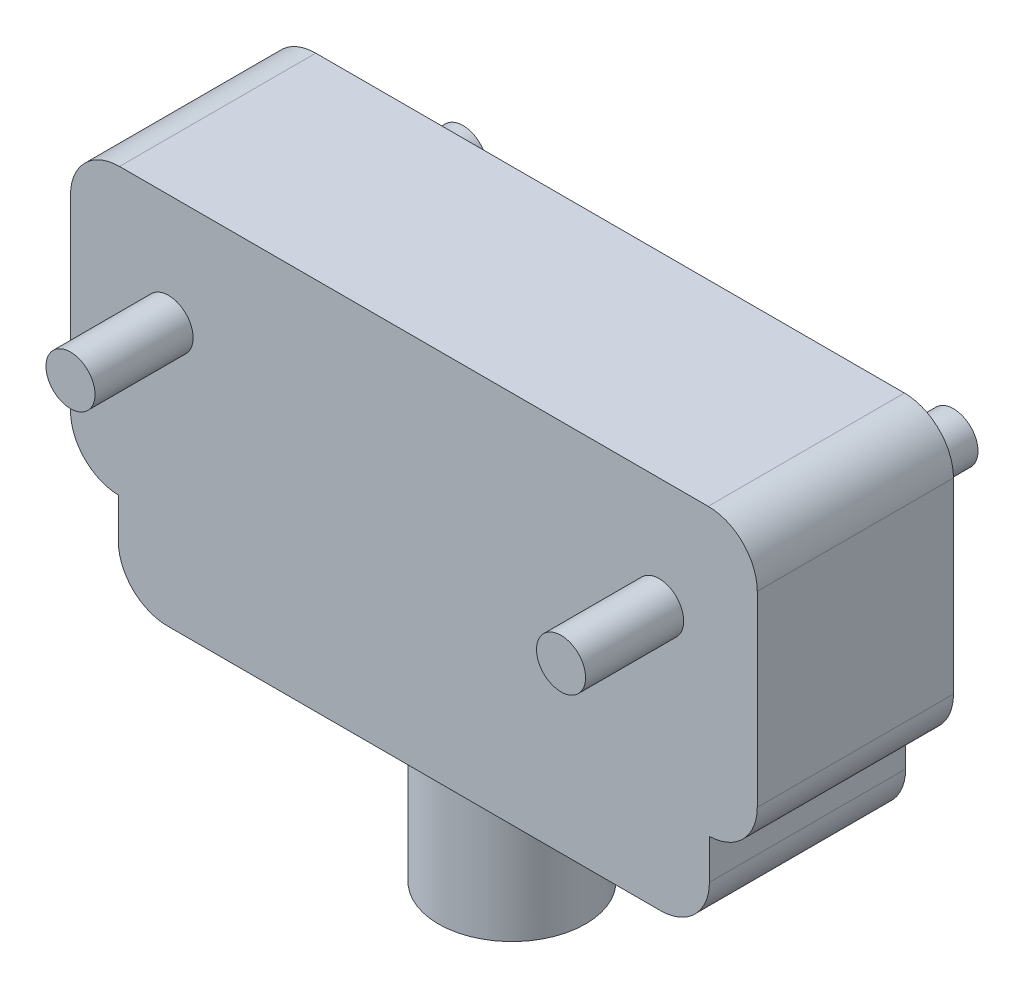
ISO-10303-21;
HEADER;
FILE_DESCRIPTION(('STEP AP214'),'2;1');
FILE_NAME('part.step','',(''),(''),'','','');
FILE_SCHEMA(('AUTOMOTIVE_DESIGN { 1 0 10303 214 1 1 1 1 }'));
ENDSEC;
DATA;
#1=APPLICATION_CONTEXT('core data for automotive mechanical design processes');
#2=APPLICATION_PROTOCOL_DEFINITION('international standard','automotive_design',2000,#1);
#3=PRODUCT_CONTEXT('',#1,'mechanical');
#4=PRODUCT('Part','Part','',(#3));
#5=PRODUCT_RELATED_PRODUCT_CATEGORY('part','',(#4));
#6=PRODUCT_DEFINITION_FORMATION('','',#4);
#7=PRODUCT_DEFINITION_CONTEXT('part definition',#1,'design');
#8=PRODUCT_DEFINITION('design','',#6,#7);
#9=PRODUCT_DEFINITION_SHAPE('','',#8);
#10=(LENGTH_UNIT() NAMED_UNIT(*) SI_UNIT(.MILLI.,.METRE.));
#11=(NAMED_UNIT(*) PLANE_ANGLE_UNIT() SI_UNIT($,.RADIAN.));
#12=(NAMED_UNIT(*) SI_UNIT($,.STERADIAN.) SOLID_ANGLE_UNIT());
#13=UNCERTAINTY_MEASURE_WITH_UNIT(LENGTH_MEASURE(1.E-05),#10,'distance_accuracy_value','');
#14=(GEOMETRIC_REPRESENTATION_CONTEXT(3) GLOBAL_UNCERTAINTY_ASSIGNED_CONTEXT((#13)) GLOBAL_UNIT_ASSIGNED_CONTEXT((#10,
#11,#12)) REPRESENTATION_CONTEXT('',''));
#15=CARTESIAN_POINT('',(0.,0.,0.));
#16=DIRECTION('',(0.,0.,1.));
#17=DIRECTION('',(1.,0.,0.));
#18=AXIS2_PLACEMENT_3D('',#15,#16,#17);
#19=CARTESIAN_POINT('',(90.0700000000001,-85.065581076565,-10.));
#20=DIRECTION('',(0.,0.,1.));
#21=DIRECTION('',(1.,0.,0.));
#22=AXIS2_PLACEMENT_3D('',#19,#20,#21);
#23=CYLINDRICAL_SURFACE('',#22,2.5);
#24=CARTESIAN_POINT('',(90.0700000000001,-85.065581076565,-10.));
#25=DIRECTION('',(0.,0.,1.));
#26=DIRECTION('',(1.,0.,0.));
#27=AXIS2_PLACEMENT_3D('',#24,#25,#26);
#28=CIRCLE('',#27,2.5);
#29=CARTESIAN_POINT('',(92.5700000000001,-85.065581076565,-10.));
#30=VERTEX_POINT('',#29);
#31=EDGE_CURVE('E160',#30,#30,#28,.T.);
#32=ORIENTED_EDGE('',*,*,#31,.T.);
#33=EDGE_LOOP('',(#32));
#34=FACE_BOUND('',#33,.T.);
#35=CARTESIAN_POINT('',(90.0700000000001,-85.065581076565,0.));
#36=DIRECTION('',(0.,0.,1.));
#37=DIRECTION('',(1.,0.,0.));
#38=AXIS2_PLACEMENT_3D('',#35,#36,#37);
#39=CIRCLE('',#38,2.5);
#40=CARTESIAN_POINT('',(92.5700000000001,-85.065581076565,0.));
#41=VERTEX_POINT('',#40);
#42=EDGE_CURVE('E156',#41,#41,#39,.T.);
#43=ORIENTED_EDGE('',*,*,#42,.F.);
#44=EDGE_LOOP('',(#43));
#45=FACE_BOUND('',#44,.T.);
#46=ADVANCED_FACE('F39',(#34,#45),#23,.T.);
#47=CARTESIAN_POINT('',(90.0700000000001,-85.065581076565,-10.));
#48=DIRECTION('',(0.,0.,1.));
#49=DIRECTION('',(1.,0.,0.));
#50=AXIS2_PLACEMENT_3D('',#47,#48,#49);
#51=PLANE('',#50);
#52=ORIENTED_EDGE('',*,*,#31,.F.);
#53=EDGE_LOOP('',(#52));
#54=FACE_BOUND('',#53,.T.);
#55=ADVANCED_FACE('F271',(#54),#51,.F.);
#56=CARTESIAN_POINT('',(30.0700000000001,-73.6824409539895,20.));
#57=DIRECTION('',(1.,0.,0.));
#58=DIRECTION('',(0.,1.,0.));
#59=AXIS2_PLACEMENT_3D('',#56,#57,#58);
#60=PLANE('',#59);
#61=DIRECTION('',(0.,-1.,0.));
#62=VECTOR('',#61,1.);
#63=CARTESIAN_POINT('',(30.0700000000001,-73.6824409539895,0.));
#64=LINE('',#63,#62);
#65=CARTESIAN_POINT('',(30.0700000000001,-78.6824409539895,0.));
#66=VERTEX_POINT('',#65);
#67=CARTESIAN_POINT('',(30.0700000000001,-97.7574937926458,0.));
#68=VERTEX_POINT('',#67);
#69=EDGE_CURVE('E212',#66,#68,#64,.T.);
#70=ORIENTED_EDGE('',*,*,#69,.T.);
#71=DIRECTION('',(0.,0.,-1.));
#72=VECTOR('',#71,1.);
#73=CARTESIAN_POINT('',(30.0700000000001,-97.7574937926458,20.));
#74=LINE('',#73,#72);
#75=CARTESIAN_POINT('',(30.0700000000001,-97.7574937926458,20.));
#76=VERTEX_POINT('',#75);
#77=EDGE_CURVE('E47',#68,#76,#74,.F.);
#78=ORIENTED_EDGE('',*,*,#77,.T.);
#79=DIRECTION('',(0.,-1.,0.));
#80=VECTOR('',#79,1.);
#81=CARTESIAN_POINT('',(30.0700000000001,-73.6824409539895,20.));
#82=LINE('',#81,#80);
#83=CARTESIAN_POINT('',(30.0700000000001,-78.6824409539895,20.));
#84=VERTEX_POINT('',#83);
#85=EDGE_CURVE('E137',#84,#76,#82,.T.);
#86=ORIENTED_EDGE('',*,*,#85,.F.);
#87=DIRECTION('',(0.,0.,-1.));
#88=VECTOR('',#87,1.);
#89=CARTESIAN_POINT('',(30.0700000000001,-78.6824409539895,20.));
#90=LINE('',#89,#88);
#91=EDGE_CURVE('E205',#84,#66,#90,.T.);
#92=ORIENTED_EDGE('',*,*,#91,.T.);
#93=EDGE_LOOP('',(#70,#78,#86,#92));
#94=FACE_BOUND('',#93,.T.);
#95=ADVANCED_FACE('F209',(#94),#60,.F.);
#96=CARTESIAN_POINT('',(34.9456611623685,-102.755947538901,20.));
#97=DIRECTION('',(1.,0.,0.));
#98=DIRECTION('',(0.,0.,-1.));
#99=AXIS2_PLACEMENT_3D('',#96,#97,#98);
#100=PLANE('',#99);
#101=DIRECTION('',(0.,-1.,0.));
#102=VECTOR('',#101,1.);
#103=CARTESIAN_POINT('',(34.9456611623685,-102.755947538901,0.));
#104=LINE('',#103,#102);
#105=CARTESIAN_POINT('',(34.9456611623685,-102.755947538901,0.));
#106=VERTEX_POINT('',#105);
#107=CARTESIAN_POINT('',(34.9456611623685,-106.806017714321,0.));
#108=VERTEX_POINT('',#107);
#109=EDGE_CURVE('E214',#106,#108,#104,.T.);
#110=ORIENTED_EDGE('',*,*,#109,.T.);
#111=DIRECTION('',(0.,0.,-1.));
#112=VECTOR('',#111,1.);
#113=CARTESIAN_POINT('',(34.9456611623685,-106.806017714321,20.));
#114=LINE('',#113,#112);
#115=CARTESIAN_POINT('',(34.9456611623685,-106.806017714321,20.));
#116=VERTEX_POINT('',#115);
#117=EDGE_CURVE('E151',#108,#116,#114,.F.);
#118=ORIENTED_EDGE('',*,*,#117,.T.);
#119=DIRECTION('',(0.,-1.,0.));
#120=VECTOR('',#119,1.);
#121=CARTESIAN_POINT('',(34.9456611623685,-102.755947538901,20.));
#122=LINE('',#121,#120);
#123=CARTESIAN_POINT('',(34.9456611623685,-102.755947538901,20.));
#124=VERTEX_POINT('',#123);
#125=EDGE_CURVE('E134',#124,#116,#122,.T.);
#126=ORIENTED_EDGE('',*,*,#125,.F.);
#127=DIRECTION('',(0.,0.,-1.));
#128=VECTOR('',#127,1.);
#129=CARTESIAN_POINT('',(34.9456611623685,-102.755947538901,20.));
#130=LINE('',#129,#128);
#131=EDGE_CURVE('E148',#124,#106,#130,.T.);
#132=ORIENTED_EDGE('',*,*,#131,.T.);
#133=EDGE_LOOP('',(#110,#118,#126,#132));
#134=FACE_BOUND('',#133,.T.);
#135=ADVANCED_FACE('F147',(#134),#100,.F.);
#136=CARTESIAN_POINT('',(34.9456611623685,-111.806017714321,20.));
#137=DIRECTION('',(0.,1.,0.));
#138=DIRECTION('',(0.,0.,1.));
#139=AXIS2_PLACEMENT_3D('',#136,#137,#138);
#140=PLANE('',#139);
#141=CARTESIAN_POINT('',(65.0700000000001,-111.806017714321,10.));
#142=DIRECTION('',(0.,1.,0.));
#143=DIRECTION('',(0.,0.,1.));
#144=AXIS2_PLACEMENT_3D('',#141,#142,#143);
#145=CIRCLE('',#144,7.50000000000001);
#146=CARTESIAN_POINT('',(65.0700000000001,-111.806017714321,17.5));
#147=VERTEX_POINT('',#146);
#148=EDGE_CURVE('E11',#147,#147,#145,.F.);
#149=ORIENTED_EDGE('',*,*,#148,.F.);
#150=EDGE_LOOP('',(#149));
#151=FACE_BOUND('',#150,.T.);
#152=DIRECTION('',(1.,0.,0.));
#153=VECTOR('',#152,1.);
#154=CARTESIAN_POINT('',(34.9456611623685,-111.806017714321,0.));
#155=LINE('',#154,#153);
#156=CARTESIAN_POINT('',(39.9456611623685,-111.806017714321,0.));
#157=VERTEX_POINT('',#156);
#158=CARTESIAN_POINT('',(90.1943388376317,-111.806017714321,0.));
#159=VERTEX_POINT('',#158);
#160=EDGE_CURVE('E217',#157,#159,#155,.T.);
#161=ORIENTED_EDGE('',*,*,#160,.T.);
#162=DIRECTION('',(0.,0.,-1.));
#163=VECTOR('',#162,1.);
#164=CARTESIAN_POINT('',(90.1943388376317,-111.806017714321,20.));
#165=LINE('',#164,#163);
#166=CARTESIAN_POINT('',(90.1943388376317,-111.806017714321,20.));
#167=VERTEX_POINT('',#166);
#168=EDGE_CURVE('E62',#159,#167,#165,.F.);
#169=ORIENTED_EDGE('',*,*,#168,.T.);
#170=DIRECTION('',(1.,0.,0.));
#171=VECTOR('',#170,1.);
#172=CARTESIAN_POINT('',(34.9456611623685,-111.806017714321,20.));
#173=LINE('',#172,#171);
#174=CARTESIAN_POINT('',(39.9456611623685,-111.806017714321,20.));
#175=VERTEX_POINT('',#174);
#176=EDGE_CURVE('E152',#175,#167,#173,.T.);
#177=ORIENTED_EDGE('',*,*,#176,.F.);
#178=DIRECTION('',(0.,0.,-1.));
#179=VECTOR('',#178,1.);
#180=CARTESIAN_POINT('',(39.9456611623685,-111.806017714321,20.));
#181=LINE('',#180,#179);
#182=EDGE_CURVE('E200',#175,#157,#181,.T.);
#183=ORIENTED_EDGE('',*,*,#182,.T.);
#184=EDGE_LOOP('',(#161,#169,#177,#183));
#185=FACE_BOUND('',#184,.T.);
#186=ADVANCED_FACE('F403',(#151,#185),#140,.F.);
#187=CARTESIAN_POINT('',(95.1943388376317,-102.755947538901,20.));
#188=DIRECTION('',(-1.,0.,0.));
#189=DIRECTION('',(0.,0.,1.));
#190=AXIS2_PLACEMENT_3D('',#187,#188,#189);
#191=PLANE('',#190);
#192=DIRECTION('',(0.,1.,0.));
#193=VECTOR('',#192,1.);
#194=CARTESIAN_POINT('',(95.1943388376317,-102.755947538901,20.));
#195=LINE('',#194,#193);
#196=CARTESIAN_POINT('',(95.1943388376317,-106.806017714321,20.));
#197=VERTEX_POINT('',#196);
#198=CARTESIAN_POINT('',(95.1943388376317,-102.755947538901,20.));
#199=VERTEX_POINT('',#198);
#200=EDGE_CURVE('E240',#197,#199,#195,.T.);
#201=ORIENTED_EDGE('',*,*,#200,.F.);
#202=DIRECTION('',(0.,0.,-1.));
#203=VECTOR('',#202,1.);
#204=CARTESIAN_POINT('',(95.1943388376317,-106.806017714321,20.));
#205=LINE('',#204,#203);
#206=CARTESIAN_POINT('',(95.1943388376317,-106.806017714321,0.));
#207=VERTEX_POINT('',#206);
#208=EDGE_CURVE('E197',#197,#207,#205,.T.);
#209=ORIENTED_EDGE('',*,*,#208,.T.);
#210=DIRECTION('',(0.,1.,0.));
#211=VECTOR('',#210,1.);
#212=CARTESIAN_POINT('',(95.1943388376317,-102.755947538901,0.));
#213=LINE('',#212,#211);
#214=CARTESIAN_POINT('',(95.1943388376317,-102.755947538901,0.));
#215=VERTEX_POINT('',#214);
#216=EDGE_CURVE('E226',#207,#215,#213,.T.);
#217=ORIENTED_EDGE('',*,*,#216,.T.);
#218=DIRECTION('',(0.,0.,-1.));
#219=VECTOR('',#218,1.);
#220=CARTESIAN_POINT('',(95.1943388376317,-102.755947538901,20.));
#221=LINE('',#220,#219);
#222=EDGE_CURVE('E157',#199,#215,#221,.T.);
#223=ORIENTED_EDGE('',*,*,#222,.F.);
#224=EDGE_LOOP('',(#201,#209,#217,#223));
#225=FACE_BOUND('',#224,.T.);
#226=ADVANCED_FACE('F267',(#225),#191,.F.);
#227=CARTESIAN_POINT('',(100.07,-73.6824409539895,20.));
#228=DIRECTION('',(-1.,0.,0.));
#229=DIRECTION('',(0.,-1.,0.));
#230=AXIS2_PLACEMENT_3D('',#227,#228,#229);
#231=PLANE('',#230);
#232=DIRECTION('',(0.,1.,0.));
#233=VECTOR('',#232,1.);
#234=CARTESIAN_POINT('',(100.07,-73.6824409539895,0.));
#235=LINE('',#234,#233);
#236=CARTESIAN_POINT('',(100.07,-97.7574937926458,0.));
#237=VERTEX_POINT('',#236);
#238=CARTESIAN_POINT('',(100.07,-78.6824409539895,0.));
#239=VERTEX_POINT('',#238);
#240=EDGE_CURVE('E229',#237,#239,#235,.T.);
#241=ORIENTED_EDGE('',*,*,#240,.T.);
#242=DIRECTION('',(0.,0.,-1.));
#243=VECTOR('',#242,1.);
#244=CARTESIAN_POINT('',(100.07,-78.6824409539895,20.));
#245=LINE('',#244,#243);
#246=CARTESIAN_POINT('',(100.07,-78.6824409539895,20.));
#247=VERTEX_POINT('',#246);
#248=EDGE_CURVE('E188',#239,#247,#245,.F.);
#249=ORIENTED_EDGE('',*,*,#248,.T.);
#250=DIRECTION('',(0.,1.,0.));
#251=VECTOR('',#250,1.);
#252=CARTESIAN_POINT('',(100.07,-73.6824409539895,20.));
#253=LINE('',#252,#251);
#254=CARTESIAN_POINT('',(100.07,-97.7574937926458,20.));
#255=VERTEX_POINT('',#254);
#256=EDGE_CURVE('E241',#255,#247,#253,.T.);
#257=ORIENTED_EDGE('',*,*,#256,.F.);
#258=DIRECTION('',(0.,0.,1.));
#259=VECTOR('',#258,1.);
#260=CARTESIAN_POINT('',(100.07,-97.7574937926458,20.));
#261=LINE('',#260,#259);
#262=EDGE_CURVE('E185',#255,#237,#261,.F.);
#263=ORIENTED_EDGE('',*,*,#262,.T.);
#264=EDGE_LOOP('',(#241,#249,#257,#263));
#265=FACE_BOUND('',#264,.T.);
#266=ADVANCED_FACE('F254',(#265),#231,.F.);
#267=CARTESIAN_POINT('',(30.0700000000001,-73.6824409539895,20.));
#268=DIRECTION('',(0.,-1.,0.));
#269=DIRECTION('',(0.,0.,-1.));
#270=AXIS2_PLACEMENT_3D('',#267,#268,#269);
#271=PLANE('',#270);
#272=DIRECTION('',(-1.,0.,0.));
#273=VECTOR('',#272,1.);
#274=CARTESIAN_POINT('',(30.0700000000001,-73.6824409539895,20.));
#275=LINE('',#274,#273);
#276=CARTESIAN_POINT('',(95.0700000000001,-73.6824409539895,20.));
#277=VERTEX_POINT('',#276);
#278=CARTESIAN_POINT('',(35.0700000000001,-73.6824409539895,20.));
#279=VERTEX_POINT('',#278);
#280=EDGE_CURVE('E163',#277,#279,#275,.T.);
#281=ORIENTED_EDGE('',*,*,#280,.F.);
#282=DIRECTION('',(0.,0.,-1.));
#283=VECTOR('',#282,1.);
#284=CARTESIAN_POINT('',(95.0700000000001,-73.6824409539895,20.));
#285=LINE('',#284,#283);
#286=CARTESIAN_POINT('',(95.0700000000001,-73.6824409539895,0.));
#287=VERTEX_POINT('',#286);
#288=EDGE_CURVE('E171',#277,#287,#285,.T.);
#289=ORIENTED_EDGE('',*,*,#288,.T.);
#290=DIRECTION('',(-1.,0.,0.));
#291=VECTOR('',#290,1.);
#292=CARTESIAN_POINT('',(30.0700000000001,-73.6824409539895,0.));
#293=LINE('',#292,#291);
#294=CARTESIAN_POINT('',(35.0700000000001,-73.6824409539895,0.));
#295=VERTEX_POINT('',#294);
#296=EDGE_CURVE('E231',#287,#295,#293,.T.);
#297=ORIENTED_EDGE('',*,*,#296,.T.);
#298=DIRECTION('',(0.,0.,-1.));
#299=VECTOR('',#298,1.);
#300=CARTESIAN_POINT('',(35.0700000000001,-73.6824409539895,20.));
#301=LINE('',#300,#299);
#302=EDGE_CURVE('E168',#295,#279,#301,.F.);
#303=ORIENTED_EDGE('',*,*,#302,.T.);
#304=EDGE_LOOP('',(#281,#289,#297,#303));
#305=FACE_BOUND('',#304,.T.);
#306=ADVANCED_FACE('F257',(#305),#271,.F.);
#307=CARTESIAN_POINT('',(0.,0.,20.));
#308=DIRECTION('',(0.,0.,1.));
#309=DIRECTION('',(1.,0.,0.));
#310=AXIS2_PLACEMENT_3D('',#307,#308,#309);
#311=PLANE('',#310);
#312=CARTESIAN_POINT('',(40.0700000000001,-85.065581076565,20.));
#313=DIRECTION('',(0.,0.,1.));
#314=DIRECTION('',(1.,0.,0.));
#315=AXIS2_PLACEMENT_3D('',#312,#313,#314);
#316=CIRCLE('',#315,2.5);
#317=CARTESIAN_POINT('',(42.5700000000001,-85.065581076565,20.));
#318=VERTEX_POINT('',#317);
#319=EDGE_CURVE('E343',#318,#318,#316,.T.);
#320=ORIENTED_EDGE('',*,*,#319,.F.);
#321=EDGE_LOOP('',(#320));
#322=FACE_BOUND('',#321,.T.);
#323=CARTESIAN_POINT('',(90.0700000000001,-85.065581076565,20.));
#324=DIRECTION('',(0.,0.,1.));
#325=DIRECTION('',(1.,0.,0.));
#326=AXIS2_PLACEMENT_3D('',#323,#324,#325);
#327=CIRCLE('',#326,2.5);
#328=CARTESIAN_POINT('',(92.5700000000001,-85.065581076565,20.));
#329=VERTEX_POINT('',#328);
#330=EDGE_CURVE('E337',#329,#329,#327,.T.);
#331=ORIENTED_EDGE('',*,*,#330,.F.);
#332=EDGE_LOOP('',(#331));
#333=FACE_BOUND('',#332,.T.);
#334=ORIENTED_EDGE('',*,*,#256,.T.);
#335=CARTESIAN_POINT('',(95.0700000000001,-78.6824409539895,20.));
#336=DIRECTION('',(0.,0.,1.));
#337=DIRECTION('',(1.,0.,0.));
#338=AXIS2_PLACEMENT_3D('',#335,#336,#337);
#339=CIRCLE('',#338,5.);
#340=EDGE_CURVE('E195',#247,#277,#339,.T.);
#341=ORIENTED_EDGE('',*,*,#340,.T.);
#342=ORIENTED_EDGE('',*,*,#280,.T.);
#343=CARTESIAN_POINT('',(35.0700000000001,-78.6824409539895,20.));
#344=DIRECTION('',(0.,0.,1.));
#345=DIRECTION('',(1.,0.,0.));
#346=AXIS2_PLACEMENT_3D('',#343,#344,#345);
#347=CIRCLE('',#346,5.);
#348=EDGE_CURVE('E142',#279,#84,#347,.T.);
#349=ORIENTED_EDGE('',*,*,#348,.T.);
#350=ORIENTED_EDGE('',*,*,#85,.T.);
#351=CARTESIAN_POINT('',(35.0700000000001,-97.7574937926458,20.));
#352=DIRECTION('',(0.,0.,1.));
#353=DIRECTION('',(1.,0.,0.));
#354=AXIS2_PLACEMENT_3D('',#351,#352,#353);
#355=CIRCLE('',#354,5.);
#356=EDGE_CURVE('E130',#76,#124,#355,.T.);
#357=ORIENTED_EDGE('',*,*,#356,.T.);
#358=ORIENTED_EDGE('',*,*,#125,.T.);
#359=CARTESIAN_POINT('',(39.9456611623685,-106.806017714321,20.));
#360=DIRECTION('',(0.,0.,1.));
#361=DIRECTION('',(1.,0.,0.));
#362=AXIS2_PLACEMENT_3D('',#359,#360,#361);
#363=CIRCLE('',#362,5.);
#364=EDGE_CURVE('E141',#116,#175,#363,.T.);
#365=ORIENTED_EDGE('',*,*,#364,.T.);
#366=ORIENTED_EDGE('',*,*,#176,.T.);
#367=CARTESIAN_POINT('',(90.1943388376317,-106.806017714321,20.));
#368=DIRECTION('',(0.,0.,1.));
#369=DIRECTION('',(1.,0.,0.));
#370=AXIS2_PLACEMENT_3D('',#367,#368,#369);
#371=CIRCLE('',#370,5.);
#372=EDGE_CURVE('E54',#167,#197,#371,.T.);
#373=ORIENTED_EDGE('',*,*,#372,.T.);
#374=ORIENTED_EDGE('',*,*,#200,.T.);
#375=CARTESIAN_POINT('',(95.0700000000001,-97.7574937926458,20.));
#376=DIRECTION('',(0.,0.,1.));
#377=DIRECTION('',(1.,0.,0.));
#378=AXIS2_PLACEMENT_3D('',#375,#376,#377);
#379=CIRCLE('',#378,5.);
#380=EDGE_CURVE('E193',#199,#255,#379,.T.);
#381=ORIENTED_EDGE('',*,*,#380,.T.);
#382=EDGE_LOOP('',(#334,#341,#342,#349,#350,#357,#358,#365,#366,#373,#374,#381));
#383=FACE_BOUND('',#382,.T.);
#384=ADVANCED_FACE('F133',(#322,#333,#383),#311,.T.);
#385=CARTESIAN_POINT('',(0.,0.,0.));
#386=DIRECTION('',(0.,0.,1.));
#387=DIRECTION('',(1.,0.,0.));
#388=AXIS2_PLACEMENT_3D('',#385,#386,#387);
#389=PLANE('',#388);
#390=CARTESIAN_POINT('',(40.0700000000001,-85.065581076565,0.));
#391=DIRECTION('',(0.,0.,1.));
#392=DIRECTION('',(1.,0.,0.));
#393=AXIS2_PLACEMENT_3D('',#390,#391,#392);
#394=CIRCLE('',#393,2.5);
#395=CARTESIAN_POINT('',(42.5700000000001,-85.065581076565,0.));
#396=VERTEX_POINT('',#395);
#397=EDGE_CURVE('E220',#396,#396,#394,.T.);
#398=ORIENTED_EDGE('',*,*,#397,.T.);
#399=EDGE_LOOP('',(#398));
#400=FACE_BOUND('',#399,.T.);
#401=ORIENTED_EDGE('',*,*,#42,.T.);
#402=EDGE_LOOP('',(#401));
#403=FACE_BOUND('',#402,.T.);
#404=ORIENTED_EDGE('',*,*,#296,.F.);
#405=CARTESIAN_POINT('',(95.0700000000001,-78.6824409539895,0.));
#406=DIRECTION('',(0.,0.,1.));
#407=DIRECTION('',(1.,0.,0.));
#408=AXIS2_PLACEMENT_3D('',#405,#406,#407);
#409=CIRCLE('',#408,5.);
#410=EDGE_CURVE('E183',#287,#239,#409,.F.);
#411=ORIENTED_EDGE('',*,*,#410,.T.);
#412=ORIENTED_EDGE('',*,*,#240,.F.);
#413=CARTESIAN_POINT('',(95.0700000000001,-97.7574937926458,0.));
#414=DIRECTION('',(0.,0.,1.));
#415=DIRECTION('',(1.,0.,0.));
#416=AXIS2_PLACEMENT_3D('',#413,#414,#415);
#417=CIRCLE('',#416,5.);
#418=EDGE_CURVE('E181',#237,#215,#417,.F.);
#419=ORIENTED_EDGE('',*,*,#418,.T.);
#420=ORIENTED_EDGE('',*,*,#216,.F.);
#421=CARTESIAN_POINT('',(90.1943388376317,-106.806017714321,0.));
#422=DIRECTION('',(0.,0.,1.));
#423=DIRECTION('',(1.,0.,0.));
#424=AXIS2_PLACEMENT_3D('',#421,#422,#423);
#425=CIRCLE('',#424,5.);
#426=EDGE_CURVE('E179',#207,#159,#425,.F.);
#427=ORIENTED_EDGE('',*,*,#426,.T.);
#428=ORIENTED_EDGE('',*,*,#160,.F.);
#429=CARTESIAN_POINT('',(39.9456611623685,-106.806017714321,0.));
#430=DIRECTION('',(0.,0.,1.));
#431=DIRECTION('',(1.,0.,0.));
#432=AXIS2_PLACEMENT_3D('',#429,#430,#431);
#433=CIRCLE('',#432,5.);
#434=EDGE_CURVE('E177',#157,#108,#433,.F.);
#435=ORIENTED_EDGE('',*,*,#434,.T.);
#436=ORIENTED_EDGE('',*,*,#109,.F.);
#437=CARTESIAN_POINT('',(35.0700000000001,-97.7574937926458,0.));
#438=DIRECTION('',(0.,0.,1.));
#439=DIRECTION('',(1.,0.,0.));
#440=AXIS2_PLACEMENT_3D('',#437,#438,#439);
#441=CIRCLE('',#440,5.);
#442=EDGE_CURVE('E155',#106,#68,#441,.F.);
#443=ORIENTED_EDGE('',*,*,#442,.T.);
#444=ORIENTED_EDGE('',*,*,#69,.F.);
#445=CARTESIAN_POINT('',(35.0700000000001,-78.6824409539895,0.));
#446=DIRECTION('',(0.,0.,1.));
#447=DIRECTION('',(1.,0.,0.));
#448=AXIS2_PLACEMENT_3D('',#445,#446,#447);
#449=CIRCLE('',#448,5.);
#450=EDGE_CURVE('E174',#66,#295,#449,.F.);
#451=ORIENTED_EDGE('',*,*,#450,.T.);
#452=EDGE_LOOP('',(#404,#411,#412,#419,#420,#427,#428,#435,#436,#443,#444,#451));
#453=FACE_BOUND('',#452,.T.);
#454=ADVANCED_FACE('F249',(#400,#403,#453),#389,.F.);
#455=CARTESIAN_POINT('',(40.0700000000001,-85.065581076565,-10.));
#456=DIRECTION('',(0.,0.,1.));
#457=DIRECTION('',(1.,0.,0.));
#458=AXIS2_PLACEMENT_3D('',#455,#456,#457);
#459=CYLINDRICAL_SURFACE('',#458,2.5);
#460=CARTESIAN_POINT('',(40.0700000000001,-85.065581076565,-10.));
#461=DIRECTION('',(0.,0.,1.));
#462=DIRECTION('',(1.,0.,0.));
#463=AXIS2_PLACEMENT_3D('',#460,#461,#462);
#464=CIRCLE('',#463,2.5);
#465=CARTESIAN_POINT('',(42.5700000000001,-85.065581076565,-10.));
#466=VERTEX_POINT('',#465);
#467=EDGE_CURVE('E215',#466,#466,#464,.T.);
#468=ORIENTED_EDGE('',*,*,#467,.T.);
#469=EDGE_LOOP('',(#468));
#470=FACE_BOUND('',#469,.T.);
#471=ORIENTED_EDGE('',*,*,#397,.F.);
#472=EDGE_LOOP('',(#471));
#473=FACE_BOUND('',#472,.T.);
#474=ADVANCED_FACE('F319',(#470,#473),#459,.T.);
#475=CARTESIAN_POINT('',(40.0700000000001,-85.065581076565,-10.));
#476=DIRECTION('',(0.,0.,1.));
#477=DIRECTION('',(1.,0.,0.));
#478=AXIS2_PLACEMENT_3D('',#475,#476,#477);
#479=PLANE('',#478);
#480=ORIENTED_EDGE('',*,*,#467,.F.);
#481=EDGE_LOOP('',(#480));
#482=FACE_BOUND('',#481,.T.);
#483=ADVANCED_FACE('F285',(#482),#479,.F.);
#484=CARTESIAN_POINT('',(95.0700000000001,-78.6824409539895,20.));
#485=DIRECTION('',(0.,0.,-1.));
#486=DIRECTION('',(-1.,0.,0.));
#487=AXIS2_PLACEMENT_3D('',#484,#485,#486);
#488=CYLINDRICAL_SURFACE('',#487,5.);
#489=ORIENTED_EDGE('',*,*,#340,.F.);
#490=ORIENTED_EDGE('',*,*,#248,.F.);
#491=ORIENTED_EDGE('',*,*,#410,.F.);
#492=ORIENTED_EDGE('',*,*,#288,.F.);
#493=EDGE_LOOP('',(#489,#490,#491,#492));
#494=FACE_BOUND('',#493,.T.);
#495=ADVANCED_FACE('F256',(#494),#488,.T.);
#496=CARTESIAN_POINT('',(95.0700000000001,-97.7574937926458,20.));
#497=DIRECTION('',(0.,0.,1.));
#498=DIRECTION('',(1.,0.,0.));
#499=AXIS2_PLACEMENT_3D('',#496,#497,#498);
#500=CYLINDRICAL_SURFACE('',#499,5.);
#501=ORIENTED_EDGE('',*,*,#380,.F.);
#502=ORIENTED_EDGE('',*,*,#222,.T.);
#503=ORIENTED_EDGE('',*,*,#418,.F.);
#504=ORIENTED_EDGE('',*,*,#262,.F.);
#505=EDGE_LOOP('',(#501,#502,#503,#504));
#506=FACE_BOUND('',#505,.T.);
#507=ADVANCED_FACE('F284',(#506),#500,.T.);
#508=CARTESIAN_POINT('',(90.1943388376317,-106.806017714321,20.));
#509=DIRECTION('',(0.,0.,-1.));
#510=DIRECTION('',(-1.,0.,0.));
#511=AXIS2_PLACEMENT_3D('',#508,#509,#510);
#512=CYLINDRICAL_SURFACE('',#511,5.);
#513=ORIENTED_EDGE('',*,*,#372,.F.);
#514=ORIENTED_EDGE('',*,*,#168,.F.);
#515=ORIENTED_EDGE('',*,*,#426,.F.);
#516=ORIENTED_EDGE('',*,*,#208,.F.);
#517=EDGE_LOOP('',(#513,#514,#515,#516));
#518=FACE_BOUND('',#517,.T.);
#519=ADVANCED_FACE('F288',(#518),#512,.T.);
#520=CARTESIAN_POINT('',(39.9456611623685,-106.806017714321,20.));
#521=DIRECTION('',(0.,0.,-1.));
#522=DIRECTION('',(-1.,0.,0.));
#523=AXIS2_PLACEMENT_3D('',#520,#521,#522);
#524=CYLINDRICAL_SURFACE('',#523,5.);
#525=ORIENTED_EDGE('',*,*,#364,.F.);
#526=ORIENTED_EDGE('',*,*,#117,.F.);
#527=ORIENTED_EDGE('',*,*,#434,.F.);
#528=ORIENTED_EDGE('',*,*,#182,.F.);
#529=EDGE_LOOP('',(#525,#526,#527,#528));
#530=FACE_BOUND('',#529,.T.);
#531=ADVANCED_FACE('F292',(#530),#524,.T.);
#532=CARTESIAN_POINT('',(35.0700000000001,-97.7574937926458,20.));
#533=DIRECTION('',(0.,0.,-1.));
#534=DIRECTION('',(-1.,0.,0.));
#535=AXIS2_PLACEMENT_3D('',#532,#533,#534);
#536=CYLINDRICAL_SURFACE('',#535,5.);
#537=ORIENTED_EDGE('',*,*,#356,.F.);
#538=ORIENTED_EDGE('',*,*,#77,.F.);
#539=ORIENTED_EDGE('',*,*,#442,.F.);
#540=ORIENTED_EDGE('',*,*,#131,.F.);
#541=EDGE_LOOP('',(#537,#538,#539,#540));
#542=FACE_BOUND('',#541,.T.);
#543=ADVANCED_FACE('F154',(#542),#536,.T.);
#544=CARTESIAN_POINT('',(35.0700000000001,-78.6824409539895,20.));
#545=DIRECTION('',(0.,0.,-1.));
#546=DIRECTION('',(-1.,0.,0.));
#547=AXIS2_PLACEMENT_3D('',#544,#545,#546);
#548=CYLINDRICAL_SURFACE('',#547,5.);
#549=ORIENTED_EDGE('',*,*,#348,.F.);
#550=ORIENTED_EDGE('',*,*,#302,.F.);
#551=ORIENTED_EDGE('',*,*,#450,.F.);
#552=ORIENTED_EDGE('',*,*,#91,.F.);
#553=EDGE_LOOP('',(#549,#550,#551,#552));
#554=FACE_BOUND('',#553,.T.);
#555=ADVANCED_FACE('F41',(#554),#548,.T.);
#556=CARTESIAN_POINT('',(65.0700000000001,-126.806017714321,10.));
#557=DIRECTION('',(0.,1.,0.));
#558=DIRECTION('',(0.,0.,1.));
#559=AXIS2_PLACEMENT_3D('',#556,#557,#558);
#560=CYLINDRICAL_SURFACE('',#559,7.50000000000001);
#561=CARTESIAN_POINT('',(65.0700000000001,-126.806017714321,10.));
#562=DIRECTION('',(0.,-1.,0.));
#563=DIRECTION('',(0.,0.,-1.));
#564=AXIS2_PLACEMENT_3D('',#561,#562,#563);
#565=CIRCLE('',#564,7.50000000000001);
#566=CARTESIAN_POINT('',(65.0700000000001,-126.806017714321,2.49999999999999));
#567=VERTEX_POINT('',#566);
#568=EDGE_CURVE('E332',#567,#567,#565,.T.);
#569=ORIENTED_EDGE('',*,*,#568,.F.);
#570=EDGE_LOOP('',(#569));
#571=FACE_BOUND('',#570,.T.);
#572=ORIENTED_EDGE('',*,*,#148,.T.);
#573=EDGE_LOOP('',(#572));
#574=FACE_BOUND('',#573,.T.);
#575=ADVANCED_FACE('F300',(#571,#574),#560,.T.);
#576=CARTESIAN_POINT('',(65.0700000000001,-126.806017714321,10.));
#577=DIRECTION('',(0.,-1.,0.));
#578=DIRECTION('',(0.,0.,-1.));
#579=AXIS2_PLACEMENT_3D('',#576,#577,#578);
#580=PLANE('',#579);
#581=ORIENTED_EDGE('',*,*,#568,.T.);
#582=EDGE_LOOP('',(#581));
#583=FACE_BOUND('',#582,.T.);
#584=ADVANCED_FACE('F304',(#583),#580,.T.);
#585=CARTESIAN_POINT('',(90.0700000000001,-85.065581076565,30.));
#586=DIRECTION('',(0.,0.,-1.));
#587=DIRECTION('',(-1.,0.,0.));
#588=AXIS2_PLACEMENT_3D('',#585,#586,#587);
#589=CYLINDRICAL_SURFACE('',#588,2.5);
#590=CARTESIAN_POINT('',(90.0700000000001,-85.065581076565,30.));
#591=DIRECTION('',(0.,0.,1.));
#592=DIRECTION('',(1.,0.,0.));
#593=AXIS2_PLACEMENT_3D('',#590,#591,#592);
#594=CIRCLE('',#593,2.5);
#595=CARTESIAN_POINT('',(92.5700000000001,-85.065581076565,30.));
#596=VERTEX_POINT('',#595);
#597=EDGE_CURVE('E334',#596,#596,#594,.T.);
#598=ORIENTED_EDGE('',*,*,#597,.F.);
#599=EDGE_LOOP('',(#598));
#600=FACE_BOUND('',#599,.T.);
#601=ORIENTED_EDGE('',*,*,#330,.T.);
#602=EDGE_LOOP('',(#601));
#603=FACE_BOUND('',#602,.T.);
#604=ADVANCED_FACE('F310',(#600,#603),#589,.T.);
#605=CARTESIAN_POINT('',(90.0700000000001,-85.065581076565,30.));
#606=DIRECTION('',(0.,0.,1.));
#607=DIRECTION('',(1.,0.,0.));
#608=AXIS2_PLACEMENT_3D('',#605,#606,#607);
#609=PLANE('',#608);
#610=ORIENTED_EDGE('',*,*,#597,.T.);
#611=EDGE_LOOP('',(#610));
#612=FACE_BOUND('',#611,.T.);
#613=ADVANCED_FACE('F354',(#612),#609,.T.);
#614=CARTESIAN_POINT('',(40.0700000000001,-85.065581076565,30.));
#615=DIRECTION('',(0.,0.,-1.));
#616=DIRECTION('',(-1.,0.,0.));
#617=AXIS2_PLACEMENT_3D('',#614,#615,#616);
#618=CYLINDRICAL_SURFACE('',#617,2.5);
#619=CARTESIAN_POINT('',(40.0700000000001,-85.065581076565,30.));
#620=DIRECTION('',(0.,0.,1.));
#621=DIRECTION('',(1.,0.,0.));
#622=AXIS2_PLACEMENT_3D('',#619,#620,#621);
#623=CIRCLE('',#622,2.5);
#624=CARTESIAN_POINT('',(42.5700000000001,-85.065581076565,30.));
#625=VERTEX_POINT('',#624);
#626=EDGE_CURVE('E341',#625,#625,#623,.T.);
#627=ORIENTED_EDGE('',*,*,#626,.F.);
#628=EDGE_LOOP('',(#627));
#629=FACE_BOUND('',#628,.T.);
#630=ORIENTED_EDGE('',*,*,#319,.T.);
#631=EDGE_LOOP('',(#630));
#632=FACE_BOUND('',#631,.T.);
#633=ADVANCED_FACE('F351',(#629,#632),#618,.T.);
#634=CARTESIAN_POINT('',(40.0700000000001,-85.065581076565,30.));
#635=DIRECTION('',(0.,0.,1.));
#636=DIRECTION('',(1.,0.,0.));
#637=AXIS2_PLACEMENT_3D('',#634,#635,#636);
#638=PLANE('',#637);
#639=ORIENTED_EDGE('',*,*,#626,.T.);
#640=EDGE_LOOP('',(#639));
#641=FACE_BOUND('',#640,.T.);
#642=ADVANCED_FACE('F349',(#641),#638,.T.);
#643=CLOSED_SHELL('',(#46,#55,#95,#135,#186,#226,#266,#306,#384,#454,#474,#483,#495,#507,#519,
#531,#543,#555,#575,#584,#604,#613,#633,#642));
#644=MANIFOLD_SOLID_BREP('B2',#643);
#645=ADVANCED_BREP_SHAPE_REPRESENTATION('',(#18,#644),#14);
#646=SHAPE_DEFINITION_REPRESENTATION(#9,#645);
ENDSEC;
END-ISO-10303-21;
